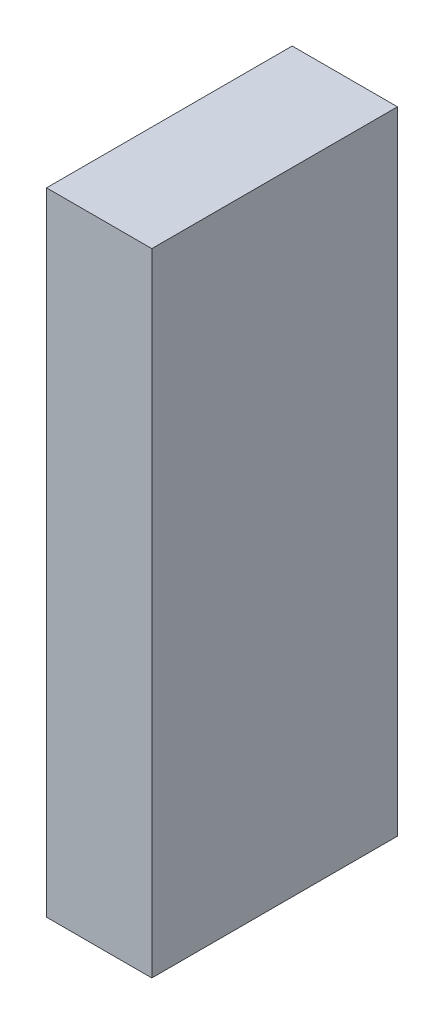
ISO-10303-21;
HEADER;
FILE_DESCRIPTION(('STEP AP214'),'2;1');
FILE_NAME('part.step','',(''),(''),'','','');
FILE_SCHEMA(('AUTOMOTIVE_DESIGN { 1 0 10303 214 1 1 1 1 }'));
ENDSEC;
DATA;
#1=APPLICATION_CONTEXT('core data for automotive mechanical design processes');
#2=APPLICATION_PROTOCOL_DEFINITION('international standard','automotive_design',2000,#1);
#3=PRODUCT_CONTEXT('',#1,'mechanical');
#4=PRODUCT('Part','Part','',(#3));
#5=PRODUCT_RELATED_PRODUCT_CATEGORY('part','',(#4));
#6=PRODUCT_DEFINITION_FORMATION('','',#4);
#7=PRODUCT_DEFINITION_CONTEXT('part definition',#1,'design');
#8=PRODUCT_DEFINITION('design','',#6,#7);
#9=PRODUCT_DEFINITION_SHAPE('','',#8);
#10=(LENGTH_UNIT() NAMED_UNIT(*) SI_UNIT(.MILLI.,.METRE.));
#11=(NAMED_UNIT(*) PLANE_ANGLE_UNIT() SI_UNIT($,.RADIAN.));
#12=(NAMED_UNIT(*) SI_UNIT($,.STERADIAN.) SOLID_ANGLE_UNIT());
#13=UNCERTAINTY_MEASURE_WITH_UNIT(LENGTH_MEASURE(1.E-05),#10,'distance_accuracy_value','');
#14=(GEOMETRIC_REPRESENTATION_CONTEXT(3) GLOBAL_UNCERTAINTY_ASSIGNED_CONTEXT((#13)) GLOBAL_UNIT_ASSIGNED_CONTEXT((#10,
#11,#12)) REPRESENTATION_CONTEXT('',''));
#15=CARTESIAN_POINT('',(0.,0.,0.));
#16=DIRECTION('',(0.,0.,1.));
#17=DIRECTION('',(1.,0.,0.));
#18=AXIS2_PLACEMENT_3D('',#15,#16,#17);
#19=CARTESIAN_POINT('',(0.,228.6,0.));
#20=DIRECTION('',(1.,0.,0.));
#21=DIRECTION('',(0.,0.,-1.));
#22=AXIS2_PLACEMENT_3D('',#19,#20,#21);
#23=PLANE('',#22);
#24=DIRECTION('',(0.,0.,1.));
#25=VECTOR('',#24,1.);
#26=CARTESIAN_POINT('',(0.,0.,0.));
#27=LINE('',#26,#25);
#28=CARTESIAN_POINT('',(0.,0.,-88.9));
#29=VERTEX_POINT('',#28);
#30=CARTESIAN_POINT('',(0.,0.,0.));
#31=VERTEX_POINT('',#30);
#32=EDGE_CURVE('E96',#29,#31,#27,.T.);
#33=ORIENTED_EDGE('',*,*,#32,.T.);
#34=DIRECTION('',(0.,-1.,0.));
#35=VECTOR('',#34,1.);
#36=CARTESIAN_POINT('',(0.,228.6,0.));
#37=LINE('',#36,#35);
#38=CARTESIAN_POINT('',(0.,228.6,0.));
#39=VERTEX_POINT('',#38);
#40=EDGE_CURVE('E11',#39,#31,#37,.T.);
#41=ORIENTED_EDGE('',*,*,#40,.F.);
#42=DIRECTION('',(0.,0.,1.));
#43=VECTOR('',#42,1.);
#44=CARTESIAN_POINT('',(0.,228.6,0.));
#45=LINE('',#44,#43);
#46=CARTESIAN_POINT('',(0.,228.6,-88.9));
#47=VERTEX_POINT('',#46);
#48=EDGE_CURVE('E84',#47,#39,#45,.T.);
#49=ORIENTED_EDGE('',*,*,#48,.F.);
#50=DIRECTION('',(0.,-1.,0.));
#51=VECTOR('',#50,1.);
#52=CARTESIAN_POINT('',(0.,228.6,-88.9));
#53=LINE('',#52,#51);
#54=EDGE_CURVE('E92',#47,#29,#53,.T.);
#55=ORIENTED_EDGE('',*,*,#54,.T.);
#56=EDGE_LOOP('',(#33,#41,#49,#55));
#57=FACE_BOUND('',#56,.T.);
#58=ADVANCED_FACE('F33',(#57),#23,.F.);
#59=CARTESIAN_POINT('',(0.,228.6,0.));
#60=DIRECTION('',(0.,0.,-1.));
#61=DIRECTION('',(-1.,0.,0.));
#62=AXIS2_PLACEMENT_3D('',#59,#60,#61);
#63=PLANE('',#62);
#64=DIRECTION('',(1.,0.,0.));
#65=VECTOR('',#64,1.);
#66=CARTESIAN_POINT('',(0.,0.,0.));
#67=LINE('',#66,#65);
#68=CARTESIAN_POINT('',(38.1,0.,0.));
#69=VERTEX_POINT('',#68);
#70=EDGE_CURVE('E88',#31,#69,#67,.T.);
#71=ORIENTED_EDGE('',*,*,#70,.T.);
#72=DIRECTION('',(0.,-1.,0.));
#73=VECTOR('',#72,1.);
#74=CARTESIAN_POINT('',(38.1,228.6,0.));
#75=LINE('',#74,#73);
#76=CARTESIAN_POINT('',(38.1,228.6,0.));
#77=VERTEX_POINT('',#76);
#78=EDGE_CURVE('E41',#77,#69,#75,.T.);
#79=ORIENTED_EDGE('',*,*,#78,.F.);
#80=DIRECTION('',(1.,0.,0.));
#81=VECTOR('',#80,1.);
#82=CARTESIAN_POINT('',(0.,228.6,0.));
#83=LINE('',#82,#81);
#84=EDGE_CURVE('E79',#39,#77,#83,.T.);
#85=ORIENTED_EDGE('',*,*,#84,.F.);
#86=ORIENTED_EDGE('',*,*,#40,.T.);
#87=EDGE_LOOP('',(#71,#79,#85,#86));
#88=FACE_BOUND('',#87,.T.);
#89=ADVANCED_FACE('F87',(#88),#63,.F.);
#90=CARTESIAN_POINT('',(38.1,228.6,0.));
#91=DIRECTION('',(-1.,0.,0.));
#92=DIRECTION('',(0.,0.,1.));
#93=AXIS2_PLACEMENT_3D('',#90,#91,#92);
#94=PLANE('',#93);
#95=DIRECTION('',(0.,0.,-1.));
#96=VECTOR('',#95,1.);
#97=CARTESIAN_POINT('',(38.1,0.,0.));
#98=LINE('',#97,#96);
#99=CARTESIAN_POINT('',(38.1,0.,-88.9));
#100=VERTEX_POINT('',#99);
#101=EDGE_CURVE('E66',#69,#100,#98,.T.);
#102=ORIENTED_EDGE('',*,*,#101,.T.);
#103=DIRECTION('',(0.,-1.,0.));
#104=VECTOR('',#103,1.);
#105=CARTESIAN_POINT('',(38.1,228.6,-88.9));
#106=LINE('',#105,#104);
#107=CARTESIAN_POINT('',(38.1,228.6,-88.9));
#108=VERTEX_POINT('',#107);
#109=EDGE_CURVE('E89',#108,#100,#106,.T.);
#110=ORIENTED_EDGE('',*,*,#109,.F.);
#111=DIRECTION('',(0.,0.,-1.));
#112=VECTOR('',#111,1.);
#113=CARTESIAN_POINT('',(38.1,228.6,0.));
#114=LINE('',#113,#112);
#115=EDGE_CURVE('E82',#77,#108,#114,.T.);
#116=ORIENTED_EDGE('',*,*,#115,.F.);
#117=ORIENTED_EDGE('',*,*,#78,.T.);
#118=EDGE_LOOP('',(#102,#110,#116,#117));
#119=FACE_BOUND('',#118,.T.);
#120=ADVANCED_FACE('F90',(#119),#94,.F.);
#121=CARTESIAN_POINT('',(0.,228.6,-88.9));
#122=DIRECTION('',(0.,0.,1.));
#123=DIRECTION('',(1.,0.,0.));
#124=AXIS2_PLACEMENT_3D('',#121,#122,#123);
#125=PLANE('',#124);
#126=DIRECTION('',(-1.,0.,0.));
#127=VECTOR('',#126,1.);
#128=CARTESIAN_POINT('',(0.,0.,-88.9));
#129=LINE('',#128,#127);
#130=EDGE_CURVE('E72',#100,#29,#129,.T.);
#131=ORIENTED_EDGE('',*,*,#130,.T.);
#132=ORIENTED_EDGE('',*,*,#54,.F.);
#133=DIRECTION('',(-1.,0.,0.));
#134=VECTOR('',#133,1.);
#135=CARTESIAN_POINT('',(0.,228.6,-88.9));
#136=LINE('',#135,#134);
#137=EDGE_CURVE('E49',#108,#47,#136,.T.);
#138=ORIENTED_EDGE('',*,*,#137,.F.);
#139=ORIENTED_EDGE('',*,*,#109,.T.);
#140=EDGE_LOOP('',(#131,#132,#138,#139));
#141=FACE_BOUND('',#140,.T.);
#142=ADVANCED_FACE('F103',(#141),#125,.F.);
#143=CARTESIAN_POINT('',(0.,228.6,0.));
#144=DIRECTION('',(0.,-1.,0.));
#145=DIRECTION('',(0.,0.,-1.));
#146=AXIS2_PLACEMENT_3D('',#143,#144,#145);
#147=PLANE('',#146);
#148=ORIENTED_EDGE('',*,*,#48,.T.);
#149=ORIENTED_EDGE('',*,*,#84,.T.);
#150=ORIENTED_EDGE('',*,*,#115,.T.);
#151=ORIENTED_EDGE('',*,*,#137,.T.);
#152=EDGE_LOOP('',(#148,#149,#150,#151));
#153=FACE_BOUND('',#152,.T.);
#154=ADVANCED_FACE('F80',(#153),#147,.F.);
#155=CARTESIAN_POINT('',(0.,0.,0.));
#156=DIRECTION('',(0.,-1.,0.));
#157=DIRECTION('',(0.,0.,-1.));
#158=AXIS2_PLACEMENT_3D('',#155,#156,#157);
#159=PLANE('',#158);
#160=ORIENTED_EDGE('',*,*,#32,.F.);
#161=ORIENTED_EDGE('',*,*,#130,.F.);
#162=ORIENTED_EDGE('',*,*,#101,.F.);
#163=ORIENTED_EDGE('',*,*,#70,.F.);
#164=EDGE_LOOP('',(#160,#161,#162,#163));
#165=FACE_BOUND('',#164,.T.);
#166=ADVANCED_FACE('F106',(#165),#159,.T.);
#167=CLOSED_SHELL('',(#58,#89,#120,#142,#154,#166));
#168=MANIFOLD_SOLID_BREP('B2',#167);
#169=ADVANCED_BREP_SHAPE_REPRESENTATION('',(#18,#168),#14);
#170=SHAPE_DEFINITION_REPRESENTATION(#9,#169);
ENDSEC;
END-ISO-10303-21;
